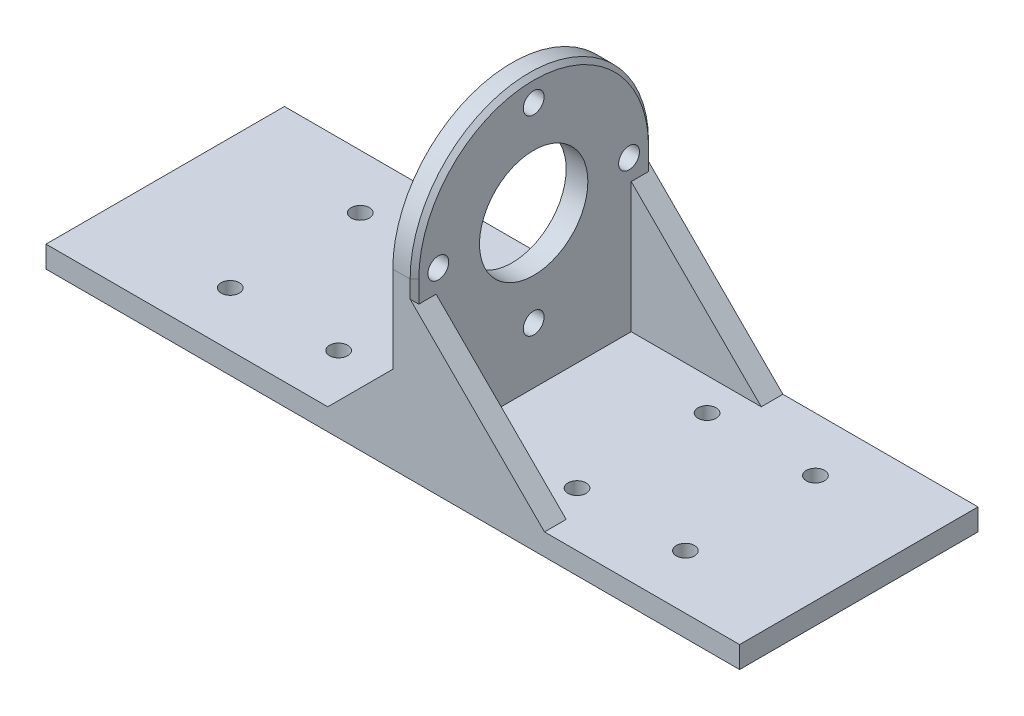
ISO-10303-21;
HEADER;
FILE_DESCRIPTION(('STEP AP214'),'2;1');
FILE_NAME('part.step','',(''),(''),'','','');
FILE_SCHEMA(('AUTOMOTIVE_DESIGN { 1 0 10303 214 1 1 1 1 }'));
ENDSEC;
DATA;
#1=APPLICATION_CONTEXT('core data for automotive mechanical design processes');
#2=APPLICATION_PROTOCOL_DEFINITION('international standard','automotive_design',2000,#1);
#3=PRODUCT_CONTEXT('',#1,'mechanical');
#4=PRODUCT('Part','Part','',(#3));
#5=PRODUCT_RELATED_PRODUCT_CATEGORY('part','',(#4));
#6=PRODUCT_DEFINITION_FORMATION('','',#4);
#7=PRODUCT_DEFINITION_CONTEXT('part definition',#1,'design');
#8=PRODUCT_DEFINITION('design','',#6,#7);
#9=PRODUCT_DEFINITION_SHAPE('','',#8);
#10=(LENGTH_UNIT() NAMED_UNIT(*) SI_UNIT(.MILLI.,.METRE.));
#11=(NAMED_UNIT(*) PLANE_ANGLE_UNIT() SI_UNIT($,.RADIAN.));
#12=(NAMED_UNIT(*) SI_UNIT($,.STERADIAN.) SOLID_ANGLE_UNIT());
#13=UNCERTAINTY_MEASURE_WITH_UNIT(LENGTH_MEASURE(1.E-05),#10,'distance_accuracy_value','');
#14=(GEOMETRIC_REPRESENTATION_CONTEXT(3) GLOBAL_UNCERTAINTY_ASSIGNED_CONTEXT((#13)) GLOBAL_UNIT_ASSIGNED_CONTEXT((#10,
#11,#12)) REPRESENTATION_CONTEXT('',''));
#15=CARTESIAN_POINT('',(0.,0.,0.));
#16=DIRECTION('',(0.,0.,1.));
#17=DIRECTION('',(1.,0.,0.));
#18=AXIS2_PLACEMENT_3D('',#15,#16,#17);
#19=CARTESIAN_POINT('',(5.,0.,0.));
#20=DIRECTION('',(1.,0.,0.));
#21=DIRECTION('',(0.,0.,-1.));
#22=AXIS2_PLACEMENT_3D('',#19,#20,#21);
#23=PLANE('',#22);
#24=DIRECTION('',(0.,0.,-1.));
#25=VECTOR('',#24,1.);
#26=CARTESIAN_POINT('',(5.,-5.00000000000001,0.));
#27=LINE('',#26,#25);
#28=CARTESIAN_POINT('',(5.,-5.00000000000001,-26.5));
#29=VERTEX_POINT('',#28);
#30=CARTESIAN_POINT('',(5.,-5.00000000000001,-22.5));
#31=VERTEX_POINT('',#30);
#32=EDGE_CURVE('E202',#29,#31,#27,.F.);
#33=ORIENTED_EDGE('',*,*,#32,.F.);
#34=DIRECTION('',(0.,1.,0.));
#35=VECTOR('',#34,1.);
#36=CARTESIAN_POINT('',(5.,0.,-26.5));
#37=LINE('',#36,#35);
#38=CARTESIAN_POINT('',(5.,0.,-26.5));
#39=VERTEX_POINT('',#38);
#40=EDGE_CURVE('E409',#29,#39,#37,.T.);
#41=ORIENTED_EDGE('',*,*,#40,.T.);
#42=CARTESIAN_POINT('',(5.,0.,0.));
#43=DIRECTION('',(1.,0.,0.));
#44=DIRECTION('',(0.,0.,-1.));
#45=AXIS2_PLACEMENT_3D('',#42,#43,#44);
#46=CIRCLE('',#45,26.5);
#47=CARTESIAN_POINT('',(5.,0.,26.5));
#48=VERTEX_POINT('',#47);
#49=EDGE_CURVE('E188',#39,#48,#46,.T.);
#50=ORIENTED_EDGE('',*,*,#49,.T.);
#51=DIRECTION('',(0.,-1.,0.));
#52=VECTOR('',#51,1.);
#53=CARTESIAN_POINT('',(5.,-5.00000000000002,26.5));
#54=LINE('',#53,#52);
#55=CARTESIAN_POINT('',(5.,-5.00000000000001,26.5));
#56=VERTEX_POINT('',#55);
#57=EDGE_CURVE('E406',#48,#56,#54,.T.);
#58=ORIENTED_EDGE('',*,*,#57,.T.);
#59=DIRECTION('',(0.,0.,1.));
#60=VECTOR('',#59,1.);
#61=CARTESIAN_POINT('',(5.,-5.00000000000001,0.));
#62=LINE('',#61,#60);
#63=CARTESIAN_POINT('',(5.,-5.00000000000001,22.5));
#64=VERTEX_POINT('',#63);
#65=EDGE_CURVE('E228',#64,#56,#62,.T.);
#66=ORIENTED_EDGE('',*,*,#65,.F.);
#67=DIRECTION('',(0.,-1.,0.));
#68=VECTOR('',#67,1.);
#69=CARTESIAN_POINT('',(5.,0.,22.5));
#70=LINE('',#69,#68);
#71=CARTESIAN_POINT('',(5.,-35.,22.5));
#72=VERTEX_POINT('',#71);
#73=EDGE_CURVE('E221',#64,#72,#70,.T.);
#74=ORIENTED_EDGE('',*,*,#73,.T.);
#75=DIRECTION('',(0.,0.,1.));
#76=VECTOR('',#75,1.);
#77=CARTESIAN_POINT('',(5.,-35.,27.5));
#78=LINE('',#77,#76);
#79=CARTESIAN_POINT('',(5.,-35.,-22.5));
#80=VERTEX_POINT('',#79);
#81=EDGE_CURVE('E232',#80,#72,#78,.T.);
#82=ORIENTED_EDGE('',*,*,#81,.F.);
#83=DIRECTION('',(0.,1.,0.));
#84=VECTOR('',#83,1.);
#85=CARTESIAN_POINT('',(5.,0.,-22.5));
#86=LINE('',#85,#84);
#87=EDGE_CURVE('E196',#80,#31,#86,.T.);
#88=ORIENTED_EDGE('',*,*,#87,.T.);
#89=EDGE_LOOP('',(#33,#41,#50,#58,#66,#74,#82,#88));
#90=FACE_BOUND('',#89,.T.);
#91=CARTESIAN_POINT('',(5.,-22.,0.));
#92=DIRECTION('',(1.,0.,0.));
#93=DIRECTION('',(0.,0.,-1.));
#94=AXIS2_PLACEMENT_3D('',#91,#92,#93);
#95=CIRCLE('',#94,2.4);
#96=CARTESIAN_POINT('',(5.,-22.,-2.4));
#97=VERTEX_POINT('',#96);
#98=EDGE_CURVE('E315',#97,#97,#95,.T.);
#99=ORIENTED_EDGE('',*,*,#98,.F.);
#100=EDGE_LOOP('',(#99));
#101=FACE_BOUND('',#100,.T.);
#102=CARTESIAN_POINT('',(5.,22.,0.));
#103=DIRECTION('',(1.,0.,0.));
#104=DIRECTION('',(0.,0.,-1.));
#105=AXIS2_PLACEMENT_3D('',#102,#103,#104);
#106=CIRCLE('',#105,2.4);
#107=CARTESIAN_POINT('',(5.,22.,-2.4));
#108=VERTEX_POINT('',#107);
#109=EDGE_CURVE('E331',#108,#108,#106,.T.);
#110=ORIENTED_EDGE('',*,*,#109,.F.);
#111=EDGE_LOOP('',(#110));
#112=FACE_BOUND('',#111,.T.);
#113=CARTESIAN_POINT('',(5.,0.,0.));
#114=DIRECTION('',(1.,0.,0.));
#115=DIRECTION('',(0.,0.,-1.));
#116=AXIS2_PLACEMENT_3D('',#113,#114,#115);
#117=CIRCLE('',#116,12.5);
#118=CARTESIAN_POINT('',(5.,0.,-12.5));
#119=VERTEX_POINT('',#118);
#120=EDGE_CURVE('E339',#119,#119,#117,.T.);
#121=ORIENTED_EDGE('',*,*,#120,.F.);
#122=EDGE_LOOP('',(#121));
#123=FACE_BOUND('',#122,.T.);
#124=CARTESIAN_POINT('',(5.,0.,-22.));
#125=DIRECTION('',(1.,0.,0.));
#126=DIRECTION('',(0.,0.,-1.));
#127=AXIS2_PLACEMENT_3D('',#124,#125,#126);
#128=CIRCLE('',#127,2.4);
#129=CARTESIAN_POINT('',(5.,0.,-24.4));
#130=VERTEX_POINT('',#129);
#131=EDGE_CURVE('E323',#130,#130,#128,.T.);
#132=ORIENTED_EDGE('',*,*,#131,.F.);
#133=EDGE_LOOP('',(#132));
#134=FACE_BOUND('',#133,.T.);
#135=CARTESIAN_POINT('',(5.,0.,22.));
#136=DIRECTION('',(1.,0.,0.));
#137=DIRECTION('',(0.,0.,-1.));
#138=AXIS2_PLACEMENT_3D('',#135,#136,#137);
#139=CIRCLE('',#138,2.4);
#140=CARTESIAN_POINT('',(5.,0.,19.6));
#141=VERTEX_POINT('',#140);
#142=EDGE_CURVE('E307',#141,#141,#139,.T.);
#143=ORIENTED_EDGE('',*,*,#142,.F.);
#144=EDGE_LOOP('',(#143));
#145=FACE_BOUND('',#144,.T.);
#146=ADVANCED_FACE('F43',(#90,#101,#112,#123,#134,#145),#23,.T.);
#147=CARTESIAN_POINT('',(0.,0.,0.));
#148=DIRECTION('',(1.,0.,0.));
#149=DIRECTION('',(0.,0.,-1.));
#150=AXIS2_PLACEMENT_3D('',#147,#148,#149);
#151=PLANE('',#150);
#152=CARTESIAN_POINT('',(0.,0.,-22.));
#153=DIRECTION('',(1.,0.,0.));
#154=DIRECTION('',(0.,0.,-1.));
#155=AXIS2_PLACEMENT_3D('',#152,#153,#154);
#156=CIRCLE('',#155,2.4);
#157=CARTESIAN_POINT('',(0.,0.,-24.4));
#158=VERTEX_POINT('',#157);
#159=EDGE_CURVE('E319',#158,#158,#156,.T.);
#160=ORIENTED_EDGE('',*,*,#159,.T.);
#161=EDGE_LOOP('',(#160));
#162=FACE_BOUND('',#161,.T.);
#163=CARTESIAN_POINT('',(0.,0.,0.));
#164=DIRECTION('',(1.,0.,0.));
#165=DIRECTION('',(0.,0.,-1.));
#166=AXIS2_PLACEMENT_3D('',#163,#164,#165);
#167=CIRCLE('',#166,27.5);
#168=CARTESIAN_POINT('',(0.,0.,-27.5));
#169=VERTEX_POINT('',#168);
#170=CARTESIAN_POINT('',(0.,0.,27.5));
#171=VERTEX_POINT('',#170);
#172=EDGE_CURVE('E343',#169,#171,#167,.T.);
#173=ORIENTED_EDGE('',*,*,#172,.F.);
#174=DIRECTION('',(0.,1.,0.));
#175=VECTOR('',#174,1.);
#176=CARTESIAN_POINT('',(0.,-40.,-27.5));
#177=LINE('',#176,#175);
#178=CARTESIAN_POINT('',(0.,-20.,-27.5));
#179=VERTEX_POINT('',#178);
#180=EDGE_CURVE('E354',#179,#169,#177,.T.);
#181=ORIENTED_EDGE('',*,*,#180,.F.);
#182=DIRECTION('',(0.,0.,1.));
#183=VECTOR('',#182,1.);
#184=CARTESIAN_POINT('',(0.,-20.,0.));
#185=LINE('',#184,#183);
#186=CARTESIAN_POINT('',(0.,-20.,-22.5));
#187=VERTEX_POINT('',#186);
#188=EDGE_CURVE('E265',#179,#187,#185,.T.);
#189=ORIENTED_EDGE('',*,*,#188,.T.);
#190=DIRECTION('',(0.,1.,0.));
#191=VECTOR('',#190,1.);
#192=CARTESIAN_POINT('',(0.,0.,-22.5));
#193=LINE('',#192,#191);
#194=CARTESIAN_POINT('',(0.,-30.,-22.5));
#195=VERTEX_POINT('',#194);
#196=EDGE_CURVE('E259',#195,#187,#193,.T.);
#197=ORIENTED_EDGE('',*,*,#196,.F.);
#198=DIRECTION('',(0.,0.,1.));
#199=VECTOR('',#198,1.);
#200=CARTESIAN_POINT('',(0.,-30.,0.));
#201=LINE('',#200,#199);
#202=CARTESIAN_POINT('',(0.,-30.,22.5));
#203=VERTEX_POINT('',#202);
#204=EDGE_CURVE('E385',#195,#203,#201,.T.);
#205=ORIENTED_EDGE('',*,*,#204,.T.);
#206=DIRECTION('',(0.,-1.,0.));
#207=VECTOR('',#206,1.);
#208=CARTESIAN_POINT('',(0.,0.,22.5));
#209=LINE('',#208,#207);
#210=CARTESIAN_POINT('',(0.,-20.,22.5));
#211=VERTEX_POINT('',#210);
#212=EDGE_CURVE('E273',#211,#203,#209,.T.);
#213=ORIENTED_EDGE('',*,*,#212,.F.);
#214=DIRECTION('',(0.,0.,-1.));
#215=VECTOR('',#214,1.);
#216=CARTESIAN_POINT('',(0.,-20.,0.));
#217=LINE('',#216,#215);
#218=CARTESIAN_POINT('',(0.,-20.,27.5));
#219=VERTEX_POINT('',#218);
#220=EDGE_CURVE('E280',#211,#219,#217,.F.);
#221=ORIENTED_EDGE('',*,*,#220,.T.);
#222=DIRECTION('',(0.,-1.,0.));
#223=VECTOR('',#222,1.);
#224=CARTESIAN_POINT('',(0.,0.,27.5));
#225=LINE('',#224,#223);
#226=EDGE_CURVE('E350',#171,#219,#225,.T.);
#227=ORIENTED_EDGE('',*,*,#226,.F.);
#228=EDGE_LOOP('',(#173,#181,#189,#197,#205,#213,#221,#227));
#229=FACE_BOUND('',#228,.T.);
#230=CARTESIAN_POINT('',(0.,0.,0.));
#231=DIRECTION('',(1.,0.,0.));
#232=DIRECTION('',(0.,0.,-1.));
#233=AXIS2_PLACEMENT_3D('',#230,#231,#232);
#234=CIRCLE('',#233,12.5);
#235=CARTESIAN_POINT('',(0.,0.,-12.5));
#236=VERTEX_POINT('',#235);
#237=EDGE_CURVE('E335',#236,#236,#234,.T.);
#238=ORIENTED_EDGE('',*,*,#237,.T.);
#239=EDGE_LOOP('',(#238));
#240=FACE_BOUND('',#239,.T.);
#241=CARTESIAN_POINT('',(0.,22.,0.));
#242=DIRECTION('',(1.,0.,0.));
#243=DIRECTION('',(0.,0.,-1.));
#244=AXIS2_PLACEMENT_3D('',#241,#242,#243);
#245=CIRCLE('',#244,2.4);
#246=CARTESIAN_POINT('',(0.,22.,-2.4));
#247=VERTEX_POINT('',#246);
#248=EDGE_CURVE('E327',#247,#247,#245,.T.);
#249=ORIENTED_EDGE('',*,*,#248,.T.);
#250=EDGE_LOOP('',(#249));
#251=FACE_BOUND('',#250,.T.);
#252=CARTESIAN_POINT('',(0.,-22.,0.));
#253=DIRECTION('',(1.,0.,0.));
#254=DIRECTION('',(0.,0.,-1.));
#255=AXIS2_PLACEMENT_3D('',#252,#253,#254);
#256=CIRCLE('',#255,2.4);
#257=CARTESIAN_POINT('',(0.,-22.,-2.4));
#258=VERTEX_POINT('',#257);
#259=EDGE_CURVE('E311',#258,#258,#256,.T.);
#260=ORIENTED_EDGE('',*,*,#259,.T.);
#261=EDGE_LOOP('',(#260));
#262=FACE_BOUND('',#261,.T.);
#263=CARTESIAN_POINT('',(0.,0.,22.));
#264=DIRECTION('',(1.,0.,0.));
#265=DIRECTION('',(0.,0.,-1.));
#266=AXIS2_PLACEMENT_3D('',#263,#264,#265);
#267=CIRCLE('',#266,2.4);
#268=CARTESIAN_POINT('',(0.,0.,19.6));
#269=VERTEX_POINT('',#268);
#270=EDGE_CURVE('E303',#269,#269,#267,.T.);
#271=ORIENTED_EDGE('',*,*,#270,.T.);
#272=EDGE_LOOP('',(#271));
#273=FACE_BOUND('',#272,.T.);
#274=ADVANCED_FACE('F509',(#162,#229,#240,#251,#262,#273),#151,.F.);
#275=CARTESIAN_POINT('',(5.,0.,0.));
#276=DIRECTION('',(-1.,0.,0.));
#277=DIRECTION('',(0.,0.,1.));
#278=AXIS2_PLACEMENT_3D('',#275,#276,#277);
#279=CYLINDRICAL_SURFACE('',#278,27.5);
#280=DIRECTION('',(-1.,0.,0.));
#281=VECTOR('',#280,1.);
#282=CARTESIAN_POINT('',(5.,0.,27.5));
#283=LINE('',#282,#281);
#284=CARTESIAN_POINT('',(3.99999999999999,0.,27.5));
#285=VERTEX_POINT('',#284);
#286=EDGE_CURVE('E368',#285,#171,#283,.T.);
#287=ORIENTED_EDGE('',*,*,#286,.F.);
#288=CARTESIAN_POINT('',(3.99999999999999,0.,0.));
#289=DIRECTION('',(1.,0.,0.));
#290=DIRECTION('',(0.,0.,-1.));
#291=AXIS2_PLACEMENT_3D('',#288,#289,#290);
#292=CIRCLE('',#291,27.5);
#293=CARTESIAN_POINT('',(3.99999999999999,0.,-27.5));
#294=VERTEX_POINT('',#293);
#295=EDGE_CURVE('E419',#285,#294,#292,.F.);
#296=ORIENTED_EDGE('',*,*,#295,.T.);
#297=DIRECTION('',(-1.,0.,0.));
#298=VECTOR('',#297,1.);
#299=CARTESIAN_POINT('',(5.,0.,-27.5));
#300=LINE('',#299,#298);
#301=EDGE_CURVE('E358',#294,#169,#300,.T.);
#302=ORIENTED_EDGE('',*,*,#301,.T.);
#303=ORIENTED_EDGE('',*,*,#172,.T.);
#304=EDGE_LOOP('',(#287,#296,#302,#303));
#305=FACE_BOUND('',#304,.T.);
#306=ADVANCED_FACE('F515',(#305),#279,.T.);
#307=CARTESIAN_POINT('',(5.,0.,27.5));
#308=DIRECTION('',(0.,0.,-1.));
#309=DIRECTION('',(0.,1.,0.));
#310=AXIS2_PLACEMENT_3D('',#307,#308,#309);
#311=PLANE('',#310);
#312=DIRECTION('',(-0.707106781186548,0.707106781186547,0.));
#313=VECTOR('',#312,1.);
#314=CARTESIAN_POINT('',(35.,-35.,27.5));
#315=LINE('',#314,#313);
#316=CARTESIAN_POINT('',(35.,-35.,27.5));
#317=VERTEX_POINT('',#316);
#318=CARTESIAN_POINT('',(3.99999999999999,-4.,27.5));
#319=VERTEX_POINT('',#318);
#320=EDGE_CURVE('E62',#317,#319,#315,.T.);
#321=ORIENTED_EDGE('',*,*,#320,.T.);
#322=DIRECTION('',(0.,1.,0.));
#323=VECTOR('',#322,1.);
#324=CARTESIAN_POINT('',(3.99999999999999,0.,27.5));
#325=LINE('',#324,#323);
#326=EDGE_CURVE('E66',#319,#285,#325,.T.);
#327=ORIENTED_EDGE('',*,*,#326,.T.);
#328=ORIENTED_EDGE('',*,*,#286,.T.);
#329=ORIENTED_EDGE('',*,*,#226,.T.);
#330=DIRECTION('',(0.707106781186548,0.707106781186547,0.));
#331=VECTOR('',#330,1.);
#332=CARTESIAN_POINT('',(-15.,-35.,27.5));
#333=LINE('',#332,#331);
#334=CARTESIAN_POINT('',(-15.,-35.,27.5));
#335=VERTEX_POINT('',#334);
#336=EDGE_CURVE('E270',#335,#219,#333,.T.);
#337=ORIENTED_EDGE('',*,*,#336,.F.);
#338=DIRECTION('',(1.,0.,0.));
#339=VECTOR('',#338,1.);
#340=CARTESIAN_POINT('',(-80.,-35.,27.5));
#341=LINE('',#340,#339);
#342=CARTESIAN_POINT('',(-80.,-35.,27.5));
#343=VERTEX_POINT('',#342);
#344=EDGE_CURVE('E299',#343,#335,#341,.T.);
#345=ORIENTED_EDGE('',*,*,#344,.F.);
#346=DIRECTION('',(0.,1.,0.));
#347=VECTOR('',#346,1.);
#348=CARTESIAN_POINT('',(-80.,-40.,27.5));
#349=LINE('',#348,#347);
#350=CARTESIAN_POINT('',(-80.,-40.,27.5));
#351=VERTEX_POINT('',#350);
#352=EDGE_CURVE('E291',#351,#343,#349,.T.);
#353=ORIENTED_EDGE('',*,*,#352,.F.);
#354=DIRECTION('',(-1.,0.,0.));
#355=VECTOR('',#354,1.);
#356=CARTESIAN_POINT('',(5.,-40.,27.5));
#357=LINE('',#356,#355);
#358=CARTESIAN_POINT('',(80.,-40.,27.5));
#359=VERTEX_POINT('',#358);
#360=EDGE_CURVE('E364',#359,#351,#357,.T.);
#361=ORIENTED_EDGE('',*,*,#360,.F.);
#362=DIRECTION('',(0.,-1.,0.));
#363=VECTOR('',#362,1.);
#364=CARTESIAN_POINT('',(80.,-40.,27.5));
#365=LINE('',#364,#363);
#366=CARTESIAN_POINT('',(80.,-35.,27.5));
#367=VERTEX_POINT('',#366);
#368=EDGE_CURVE('E233',#367,#359,#365,.T.);
#369=ORIENTED_EDGE('',*,*,#368,.F.);
#370=DIRECTION('',(-1.,0.,0.));
#371=VECTOR('',#370,1.);
#372=CARTESIAN_POINT('',(80.,-35.,27.5));
#373=LINE('',#372,#371);
#374=EDGE_CURVE('E247',#367,#317,#373,.T.);
#375=ORIENTED_EDGE('',*,*,#374,.T.);
#376=EDGE_LOOP('',(#321,#327,#328,#329,#337,#345,#353,#361,#369,#375));
#377=FACE_BOUND('',#376,.T.);
#378=ADVANCED_FACE('F530',(#377),#311,.F.);
#379=CARTESIAN_POINT('',(5.,-40.,27.5));
#380=DIRECTION('',(0.,1.,0.));
#381=DIRECTION('',(0.,0.,1.));
#382=AXIS2_PLACEMENT_3D('',#379,#380,#381);
#383=PLANE('',#382);
#384=CARTESIAN_POINT('',(55.,-40.,15.));
#385=DIRECTION('',(0.,1.,0.));
#386=DIRECTION('',(0.,0.,1.));
#387=AXIS2_PLACEMENT_3D('',#384,#385,#386);
#388=CIRCLE('',#387,2.1);
#389=CARTESIAN_POINT('',(55.,-40.,17.1));
#390=VERTEX_POINT('',#389);
#391=EDGE_CURVE('E455',#390,#390,#388,.F.);
#392=ORIENTED_EDGE('',*,*,#391,.F.);
#393=EDGE_LOOP('',(#392));
#394=FACE_BOUND('',#393,.T.);
#395=CARTESIAN_POINT('',(-25.,-40.,-15.));
#396=DIRECTION('',(0.,1.,0.));
#397=DIRECTION('',(0.,0.,1.));
#398=AXIS2_PLACEMENT_3D('',#395,#396,#397);
#399=CIRCLE('',#398,2.1);
#400=CARTESIAN_POINT('',(-25.,-40.,-12.9));
#401=VERTEX_POINT('',#400);
#402=EDGE_CURVE('E454',#401,#401,#399,.F.);
#403=ORIENTED_EDGE('',*,*,#402,.F.);
#404=EDGE_LOOP('',(#403));
#405=FACE_BOUND('',#404,.T.);
#406=CARTESIAN_POINT('',(-50.,-40.,-15.));
#407=DIRECTION('',(0.,1.,0.));
#408=DIRECTION('',(0.,0.,1.));
#409=AXIS2_PLACEMENT_3D('',#406,#407,#408);
#410=CIRCLE('',#409,2.1);
#411=CARTESIAN_POINT('',(-50.,-40.,-12.9));
#412=VERTEX_POINT('',#411);
#413=EDGE_CURVE('E473',#412,#412,#410,.F.);
#414=ORIENTED_EDGE('',*,*,#413,.F.);
#415=EDGE_LOOP('',(#414));
#416=FACE_BOUND('',#415,.T.);
#417=CARTESIAN_POINT('',(55.,-40.,-15.));
#418=DIRECTION('',(0.,1.,0.));
#419=DIRECTION('',(0.,0.,1.));
#420=AXIS2_PLACEMENT_3D('',#417,#418,#419);
#421=CIRCLE('',#420,2.1);
#422=CARTESIAN_POINT('',(55.,-40.,-12.9));
#423=VERTEX_POINT('',#422);
#424=EDGE_CURVE('E472',#423,#423,#421,.F.);
#425=ORIENTED_EDGE('',*,*,#424,.F.);
#426=EDGE_LOOP('',(#425));
#427=FACE_BOUND('',#426,.T.);
#428=CARTESIAN_POINT('',(30.,-40.,15.));
#429=DIRECTION('',(0.,1.,0.));
#430=DIRECTION('',(0.,0.,1.));
#431=AXIS2_PLACEMENT_3D('',#428,#429,#430);
#432=CIRCLE('',#431,2.1);
#433=CARTESIAN_POINT('',(30.,-40.,17.1));
#434=VERTEX_POINT('',#433);
#435=EDGE_CURVE('E464',#434,#434,#432,.F.);
#436=ORIENTED_EDGE('',*,*,#435,.F.);
#437=EDGE_LOOP('',(#436));
#438=FACE_BOUND('',#437,.T.);
#439=CARTESIAN_POINT('',(-25.,-40.,15.));
#440=DIRECTION('',(0.,1.,0.));
#441=DIRECTION('',(0.,0.,1.));
#442=AXIS2_PLACEMENT_3D('',#439,#440,#441);
#443=CIRCLE('',#442,2.1);
#444=CARTESIAN_POINT('',(-25.,-40.,17.1));
#445=VERTEX_POINT('',#444);
#446=EDGE_CURVE('E447',#445,#445,#443,.F.);
#447=ORIENTED_EDGE('',*,*,#446,.F.);
#448=EDGE_LOOP('',(#447));
#449=FACE_BOUND('',#448,.T.);
#450=CARTESIAN_POINT('',(-50.,-40.,15.));
#451=DIRECTION('',(0.,1.,0.));
#452=DIRECTION('',(0.,0.,1.));
#453=AXIS2_PLACEMENT_3D('',#450,#451,#452);
#454=CIRCLE('',#453,2.1);
#455=CARTESIAN_POINT('',(-50.,-40.,17.1));
#456=VERTEX_POINT('',#455);
#457=EDGE_CURVE('E438',#456,#456,#454,.F.);
#458=ORIENTED_EDGE('',*,*,#457,.F.);
#459=EDGE_LOOP('',(#458));
#460=FACE_BOUND('',#459,.T.);
#461=CARTESIAN_POINT('',(30.,-40.,-15.));
#462=DIRECTION('',(0.,1.,0.));
#463=DIRECTION('',(0.,0.,1.));
#464=AXIS2_PLACEMENT_3D('',#461,#462,#463);
#465=CIRCLE('',#464,2.1);
#466=CARTESIAN_POINT('',(30.,-40.,-12.9));
#467=VERTEX_POINT('',#466);
#468=EDGE_CURVE('E205',#467,#467,#465,.F.);
#469=ORIENTED_EDGE('',*,*,#468,.F.);
#470=EDGE_LOOP('',(#469));
#471=FACE_BOUND('',#470,.T.);
#472=DIRECTION('',(0.,0.,1.));
#473=VECTOR('',#472,1.);
#474=CARTESIAN_POINT('',(-80.,-40.,-27.5));
#475=LINE('',#474,#473);
#476=CARTESIAN_POINT('',(-80.,-40.,-27.5));
#477=VERTEX_POINT('',#476);
#478=EDGE_CURVE('E295',#477,#351,#475,.T.);
#479=ORIENTED_EDGE('',*,*,#478,.F.);
#480=DIRECTION('',(-1.,0.,0.));
#481=VECTOR('',#480,1.);
#482=CARTESIAN_POINT('',(5.,-40.,-27.5));
#483=LINE('',#482,#481);
#484=CARTESIAN_POINT('',(80.,-40.,-27.5));
#485=VERTEX_POINT('',#484);
#486=EDGE_CURVE('E361',#485,#477,#483,.T.);
#487=ORIENTED_EDGE('',*,*,#486,.F.);
#488=DIRECTION('',(0.,0.,-1.));
#489=VECTOR('',#488,1.);
#490=CARTESIAN_POINT('',(80.,-40.,27.5));
#491=LINE('',#490,#489);
#492=EDGE_CURVE('E237',#359,#485,#491,.T.);
#493=ORIENTED_EDGE('',*,*,#492,.F.);
#494=ORIENTED_EDGE('',*,*,#360,.T.);
#495=EDGE_LOOP('',(#479,#487,#493,#494));
#496=FACE_BOUND('',#495,.T.);
#497=ADVANCED_FACE('F526',(#394,#405,#416,#427,#438,#449,#460,#471,#496),#383,.F.);
#498=CARTESIAN_POINT('',(5.,-40.,-27.5));
#499=DIRECTION('',(0.,0.,1.));
#500=DIRECTION('',(0.,-1.,0.));
#501=AXIS2_PLACEMENT_3D('',#498,#499,#500);
#502=PLANE('',#501);
#503=ORIENTED_EDGE('',*,*,#301,.F.);
#504=DIRECTION('',(0.,-1.,0.));
#505=VECTOR('',#504,1.);
#506=CARTESIAN_POINT('',(3.99999999999999,-5.00000000000002,-27.5));
#507=LINE('',#506,#505);
#508=CARTESIAN_POINT('',(4.,-4.00000000000001,-27.5));
#509=VERTEX_POINT('',#508);
#510=EDGE_CURVE('E413',#294,#509,#507,.T.);
#511=ORIENTED_EDGE('',*,*,#510,.T.);
#512=DIRECTION('',(-0.707106781186548,0.707106781186547,0.));
#513=VECTOR('',#512,1.);
#514=CARTESIAN_POINT('',(35.,-35.,-27.5));
#515=LINE('',#514,#513);
#516=CARTESIAN_POINT('',(35.,-35.,-27.5));
#517=VERTEX_POINT('',#516);
#518=EDGE_CURVE('E204',#517,#509,#515,.T.);
#519=ORIENTED_EDGE('',*,*,#518,.F.);
#520=DIRECTION('',(-1.,0.,0.));
#521=VECTOR('',#520,1.);
#522=CARTESIAN_POINT('',(80.,-35.,-27.5));
#523=LINE('',#522,#521);
#524=CARTESIAN_POINT('',(80.,-35.,-27.5));
#525=VERTEX_POINT('',#524);
#526=EDGE_CURVE('E183',#525,#517,#523,.T.);
#527=ORIENTED_EDGE('',*,*,#526,.F.);
#528=DIRECTION('',(0.,1.,0.));
#529=VECTOR('',#528,1.);
#530=CARTESIAN_POINT('',(80.,-40.,-27.5));
#531=LINE('',#530,#529);
#532=EDGE_CURVE('E241',#485,#525,#531,.T.);
#533=ORIENTED_EDGE('',*,*,#532,.F.);
#534=ORIENTED_EDGE('',*,*,#486,.T.);
#535=DIRECTION('',(0.,1.,0.));
#536=VECTOR('',#535,1.);
#537=CARTESIAN_POINT('',(-80.,-40.,-27.5));
#538=LINE('',#537,#536);
#539=CARTESIAN_POINT('',(-80.,-35.,-27.5));
#540=VERTEX_POINT('',#539);
#541=EDGE_CURVE('E284',#477,#540,#538,.T.);
#542=ORIENTED_EDGE('',*,*,#541,.T.);
#543=DIRECTION('',(1.,0.,0.));
#544=VECTOR('',#543,1.);
#545=CARTESIAN_POINT('',(-80.,-35.,-27.5));
#546=LINE('',#545,#544);
#547=CARTESIAN_POINT('',(-15.,-35.,-27.5));
#548=VERTEX_POINT('',#547);
#549=EDGE_CURVE('E298',#540,#548,#546,.T.);
#550=ORIENTED_EDGE('',*,*,#549,.T.);
#551=DIRECTION('',(0.707106781186548,0.707106781186547,0.));
#552=VECTOR('',#551,1.);
#553=CARTESIAN_POINT('',(-15.,-35.,-27.5));
#554=LINE('',#553,#552);
#555=EDGE_CURVE('E255',#548,#179,#554,.T.);
#556=ORIENTED_EDGE('',*,*,#555,.T.);
#557=ORIENTED_EDGE('',*,*,#180,.T.);
#558=EDGE_LOOP('',(#503,#511,#519,#527,#533,#534,#542,#550,#556,#557));
#559=FACE_BOUND('',#558,.T.);
#560=ADVANCED_FACE('F523',(#559),#502,.F.);
#561=CARTESIAN_POINT('',(5.,0.,0.));
#562=DIRECTION('',(-1.,0.,0.));
#563=DIRECTION('',(0.,0.,1.));
#564=AXIS2_PLACEMENT_3D('',#561,#562,#563);
#565=CYLINDRICAL_SURFACE('',#564,12.5);
#566=ORIENTED_EDGE('',*,*,#120,.T.);
#567=EDGE_LOOP('',(#566));
#568=FACE_BOUND('',#567,.T.);
#569=ORIENTED_EDGE('',*,*,#237,.F.);
#570=EDGE_LOOP('',(#569));
#571=FACE_BOUND('',#570,.T.);
#572=ADVANCED_FACE('F520',(#568,#571),#565,.F.);
#573=CARTESIAN_POINT('',(5.,22.,0.));
#574=DIRECTION('',(-1.,0.,0.));
#575=DIRECTION('',(0.,0.,1.));
#576=AXIS2_PLACEMENT_3D('',#573,#574,#575);
#577=CYLINDRICAL_SURFACE('',#576,2.4);
#578=ORIENTED_EDGE('',*,*,#109,.T.);
#579=EDGE_LOOP('',(#578));
#580=FACE_BOUND('',#579,.T.);
#581=ORIENTED_EDGE('',*,*,#248,.F.);
#582=EDGE_LOOP('',(#581));
#583=FACE_BOUND('',#582,.T.);
#584=ADVANCED_FACE('F629',(#580,#583),#577,.F.);
#585=CARTESIAN_POINT('',(5.,0.,-22.));
#586=DIRECTION('',(-1.,0.,0.));
#587=DIRECTION('',(0.,0.,1.));
#588=AXIS2_PLACEMENT_3D('',#585,#586,#587);
#589=CYLINDRICAL_SURFACE('',#588,2.4);
#590=ORIENTED_EDGE('',*,*,#159,.F.);
#591=EDGE_LOOP('',(#590));
#592=FACE_BOUND('',#591,.T.);
#593=ORIENTED_EDGE('',*,*,#131,.T.);
#594=EDGE_LOOP('',(#593));
#595=FACE_BOUND('',#594,.T.);
#596=ADVANCED_FACE('F626',(#592,#595),#589,.F.);
#597=CARTESIAN_POINT('',(5.,-22.,0.));
#598=DIRECTION('',(-1.,0.,0.));
#599=DIRECTION('',(0.,0.,1.));
#600=AXIS2_PLACEMENT_3D('',#597,#598,#599);
#601=CYLINDRICAL_SURFACE('',#600,2.4);
#602=ORIENTED_EDGE('',*,*,#98,.T.);
#603=EDGE_LOOP('',(#602));
#604=FACE_BOUND('',#603,.T.);
#605=ORIENTED_EDGE('',*,*,#259,.F.);
#606=EDGE_LOOP('',(#605));
#607=FACE_BOUND('',#606,.T.);
#608=ADVANCED_FACE('F622',(#604,#607),#601,.F.);
#609=CARTESIAN_POINT('',(5.,0.,22.));
#610=DIRECTION('',(-1.,0.,0.));
#611=DIRECTION('',(0.,0.,1.));
#612=AXIS2_PLACEMENT_3D('',#609,#610,#611);
#613=CYLINDRICAL_SURFACE('',#612,2.4);
#614=ORIENTED_EDGE('',*,*,#270,.F.);
#615=EDGE_LOOP('',(#614));
#616=FACE_BOUND('',#615,.T.);
#617=ORIENTED_EDGE('',*,*,#142,.T.);
#618=EDGE_LOOP('',(#617));
#619=FACE_BOUND('',#618,.T.);
#620=ADVANCED_FACE('F615',(#616,#619),#613,.F.);
#621=CARTESIAN_POINT('',(-80.,-35.,-27.5));
#622=DIRECTION('',(0.,1.,0.));
#623=DIRECTION('',(0.,0.,1.));
#624=AXIS2_PLACEMENT_3D('',#621,#622,#623);
#625=PLANE('',#624);
#626=CARTESIAN_POINT('',(-25.,-35.,-15.));
#627=DIRECTION('',(0.,1.,0.));
#628=DIRECTION('',(0.,0.,1.));
#629=AXIS2_PLACEMENT_3D('',#626,#627,#628);
#630=CIRCLE('',#629,2.1);
#631=CARTESIAN_POINT('',(-25.,-35.,-12.9));
#632=VERTEX_POINT('',#631);
#633=EDGE_CURVE('E450',#632,#632,#630,.T.);
#634=ORIENTED_EDGE('',*,*,#633,.F.);
#635=EDGE_LOOP('',(#634));
#636=FACE_BOUND('',#635,.T.);
#637=CARTESIAN_POINT('',(-50.,-35.,-15.));
#638=DIRECTION('',(0.,1.,0.));
#639=DIRECTION('',(0.,0.,1.));
#640=AXIS2_PLACEMENT_3D('',#637,#638,#639);
#641=CIRCLE('',#640,2.1);
#642=CARTESIAN_POINT('',(-50.,-35.,-12.9));
#643=VERTEX_POINT('',#642);
#644=EDGE_CURVE('E459',#643,#643,#641,.T.);
#645=ORIENTED_EDGE('',*,*,#644,.F.);
#646=EDGE_LOOP('',(#645));
#647=FACE_BOUND('',#646,.T.);
#648=CARTESIAN_POINT('',(-25.,-35.,15.));
#649=DIRECTION('',(0.,1.,0.));
#650=DIRECTION('',(0.,0.,-1.));
#651=AXIS2_PLACEMENT_3D('',#648,#649,#650);
#652=CIRCLE('',#651,2.1);
#653=CARTESIAN_POINT('',(-25.,-35.,12.9));
#654=VERTEX_POINT('',#653);
#655=EDGE_CURVE('E444',#654,#654,#652,.T.);
#656=ORIENTED_EDGE('',*,*,#655,.F.);
#657=EDGE_LOOP('',(#656));
#658=FACE_BOUND('',#657,.T.);
#659=CARTESIAN_POINT('',(-50.,-35.,15.));
#660=DIRECTION('',(0.,1.,0.));
#661=DIRECTION('',(0.,0.,-1.));
#662=AXIS2_PLACEMENT_3D('',#659,#660,#661);
#663=CIRCLE('',#662,2.1);
#664=CARTESIAN_POINT('',(-50.,-35.,12.9));
#665=VERTEX_POINT('',#664);
#666=EDGE_CURVE('E432',#665,#665,#663,.T.);
#667=ORIENTED_EDGE('',*,*,#666,.F.);
#668=EDGE_LOOP('',(#667));
#669=FACE_BOUND('',#668,.T.);
#670=DIRECTION('',(0.,0.,1.));
#671=VECTOR('',#670,1.);
#672=CARTESIAN_POINT('',(-80.,-35.,-27.5));
#673=LINE('',#672,#671);
#674=EDGE_CURVE('E288',#540,#343,#673,.T.);
#675=ORIENTED_EDGE('',*,*,#674,.T.);
#676=ORIENTED_EDGE('',*,*,#344,.T.);
#677=DIRECTION('',(0.,0.,-1.));
#678=VECTOR('',#677,1.);
#679=CARTESIAN_POINT('',(-15.,-35.,-27.5));
#680=LINE('',#679,#678);
#681=CARTESIAN_POINT('',(-15.,-35.,22.5));
#682=VERTEX_POINT('',#681);
#683=EDGE_CURVE('E375',#682,#335,#680,.F.);
#684=ORIENTED_EDGE('',*,*,#683,.F.);
#685=DIRECTION('',(1.,0.,0.));
#686=VECTOR('',#685,1.);
#687=CARTESIAN_POINT('',(-80.,-35.,22.5));
#688=LINE('',#687,#686);
#689=CARTESIAN_POINT('',(-4.99999999999998,-35.,22.5));
#690=VERTEX_POINT('',#689);
#691=EDGE_CURVE('E371',#682,#690,#688,.T.);
#692=ORIENTED_EDGE('',*,*,#691,.T.);
#693=DIRECTION('',(0.,0.,-1.));
#694=VECTOR('',#693,1.);
#695=CARTESIAN_POINT('',(-4.99999999999998,-35.,-27.5));
#696=LINE('',#695,#694);
#697=CARTESIAN_POINT('',(-4.99999999999998,-35.,-22.5));
#698=VERTEX_POINT('',#697);
#699=EDGE_CURVE('E392',#690,#698,#696,.T.);
#700=ORIENTED_EDGE('',*,*,#699,.T.);
#701=DIRECTION('',(-1.,0.,0.));
#702=VECTOR('',#701,1.);
#703=CARTESIAN_POINT('',(-80.,-35.,-22.5));
#704=LINE('',#703,#702);
#705=CARTESIAN_POINT('',(-15.,-35.,-22.5));
#706=VERTEX_POINT('',#705);
#707=EDGE_CURVE('E378',#698,#706,#704,.T.);
#708=ORIENTED_EDGE('',*,*,#707,.T.);
#709=DIRECTION('',(0.,0.,1.));
#710=VECTOR('',#709,1.);
#711=CARTESIAN_POINT('',(-15.,-35.,-27.5));
#712=LINE('',#711,#710);
#713=EDGE_CURVE('E381',#548,#706,#712,.T.);
#714=ORIENTED_EDGE('',*,*,#713,.F.);
#715=ORIENTED_EDGE('',*,*,#549,.F.);
#716=EDGE_LOOP('',(#675,#676,#684,#692,#700,#708,#714,#715));
#717=FACE_BOUND('',#716,.T.);
#718=ADVANCED_FACE('F587',(#636,#647,#658,#669,#717),#625,.T.);
#719=CARTESIAN_POINT('',(-80.,0.,0.));
#720=DIRECTION('',(1.,0.,0.));
#721=DIRECTION('',(0.,0.,-1.));
#722=AXIS2_PLACEMENT_3D('',#719,#720,#721);
#723=PLANE('',#722);
#724=ORIENTED_EDGE('',*,*,#478,.T.);
#725=ORIENTED_EDGE('',*,*,#352,.T.);
#726=ORIENTED_EDGE('',*,*,#674,.F.);
#727=ORIENTED_EDGE('',*,*,#541,.F.);
#728=EDGE_LOOP('',(#724,#725,#726,#727));
#729=FACE_BOUND('',#728,.T.);
#730=ADVANCED_FACE('F600',(#729),#723,.F.);
#731=CARTESIAN_POINT('',(-15.,-35.,25.));
#732=DIRECTION('',(0.707106781186547,-0.707106781186548,0.));
#733=DIRECTION('',(0.707106781186548,0.707106781186547,0.));
#734=AXIS2_PLACEMENT_3D('',#731,#732,#733);
#735=PLANE('',#734);
#736=ORIENTED_EDGE('',*,*,#220,.F.);
#737=DIRECTION('',(0.707106781186548,0.707106781186547,0.));
#738=VECTOR('',#737,1.);
#739=CARTESIAN_POINT('',(-15.,-35.,22.5));
#740=LINE('',#739,#738);
#741=EDGE_CURVE('E269',#682,#211,#740,.T.);
#742=ORIENTED_EDGE('',*,*,#741,.F.);
#743=ORIENTED_EDGE('',*,*,#683,.T.);
#744=ORIENTED_EDGE('',*,*,#336,.T.);
#745=EDGE_LOOP('',(#736,#742,#743,#744));
#746=FACE_BOUND('',#745,.T.);
#747=ADVANCED_FACE('F581',(#746),#735,.F.);
#748=CARTESIAN_POINT('',(-37.5,-6.25,22.5));
#749=DIRECTION('',(0.,0.,1.));
#750=DIRECTION('',(1.,0.,0.));
#751=AXIS2_PLACEMENT_3D('',#748,#749,#750);
#752=PLANE('',#751);
#753=ORIENTED_EDGE('',*,*,#212,.T.);
#754=DIRECTION('',(-0.707106781186544,-0.707106781186551,0.));
#755=VECTOR('',#754,1.);
#756=CARTESIAN_POINT('',(0.,-30.,22.5));
#757=LINE('',#756,#755);
#758=EDGE_CURVE('E389',#203,#690,#757,.T.);
#759=ORIENTED_EDGE('',*,*,#758,.T.);
#760=ORIENTED_EDGE('',*,*,#691,.F.);
#761=ORIENTED_EDGE('',*,*,#741,.T.);
#762=EDGE_LOOP('',(#753,#759,#760,#761));
#763=FACE_BOUND('',#762,.T.);
#764=ADVANCED_FACE('F584',(#763),#752,.F.);
#765=CARTESIAN_POINT('',(-15.,-35.,-25.));
#766=DIRECTION('',(-0.707106781186547,0.707106781186548,0.));
#767=DIRECTION('',(0.707106781186548,0.707106781186547,0.));
#768=AXIS2_PLACEMENT_3D('',#765,#766,#767);
#769=PLANE('',#768);
#770=ORIENTED_EDGE('',*,*,#188,.F.);
#771=ORIENTED_EDGE('',*,*,#555,.F.);
#772=ORIENTED_EDGE('',*,*,#713,.T.);
#773=DIRECTION('',(0.707106781186548,0.707106781186547,0.));
#774=VECTOR('',#773,1.);
#775=CARTESIAN_POINT('',(-15.,-35.,-22.5));
#776=LINE('',#775,#774);
#777=EDGE_CURVE('E254',#706,#187,#776,.T.);
#778=ORIENTED_EDGE('',*,*,#777,.T.);
#779=EDGE_LOOP('',(#770,#771,#772,#778));
#780=FACE_BOUND('',#779,.T.);
#781=ADVANCED_FACE('F595',(#780),#769,.T.);
#782=CARTESIAN_POINT('',(-37.5,-6.25,-22.5));
#783=DIRECTION('',(0.,0.,-1.));
#784=DIRECTION('',(-1.,0.,0.));
#785=AXIS2_PLACEMENT_3D('',#782,#783,#784);
#786=PLANE('',#785);
#787=ORIENTED_EDGE('',*,*,#707,.F.);
#788=DIRECTION('',(0.707106781186544,0.707106781186551,0.));
#789=VECTOR('',#788,1.);
#790=CARTESIAN_POINT('',(0.,-30.,-22.5));
#791=LINE('',#790,#789);
#792=EDGE_CURVE('E395',#698,#195,#791,.T.);
#793=ORIENTED_EDGE('',*,*,#792,.T.);
#794=ORIENTED_EDGE('',*,*,#196,.T.);
#795=ORIENTED_EDGE('',*,*,#777,.F.);
#796=EDGE_LOOP('',(#787,#793,#794,#795));
#797=FACE_BOUND('',#796,.T.);
#798=ADVANCED_FACE('F502',(#797),#786,.F.);
#799=CARTESIAN_POINT('',(0.,-30.,0.));
#800=DIRECTION('',(0.707106781186551,-0.707106781186544,0.));
#801=DIRECTION('',(0.,0.,1.));
#802=AXIS2_PLACEMENT_3D('',#799,#800,#801);
#803=PLANE('',#802);
#804=ORIENTED_EDGE('',*,*,#792,.F.);
#805=ORIENTED_EDGE('',*,*,#699,.F.);
#806=ORIENTED_EDGE('',*,*,#758,.F.);
#807=ORIENTED_EDGE('',*,*,#204,.F.);
#808=EDGE_LOOP('',(#804,#805,#806,#807));
#809=FACE_BOUND('',#808,.T.);
#810=ADVANCED_FACE('F492',(#809),#803,.F.);
#811=CARTESIAN_POINT('',(80.,-35.,27.5));
#812=DIRECTION('',(0.,-1.,0.));
#813=DIRECTION('',(0.,0.,-1.));
#814=AXIS2_PLACEMENT_3D('',#811,#812,#813);
#815=PLANE('',#814);
#816=CARTESIAN_POINT('',(55.,-35.,15.));
#817=DIRECTION('',(0.,1.,0.));
#818=DIRECTION('',(0.,0.,-1.));
#819=AXIS2_PLACEMENT_3D('',#816,#817,#818);
#820=CIRCLE('',#819,2.1);
#821=CARTESIAN_POINT('',(55.,-35.,12.9));
#822=VERTEX_POINT('',#821);
#823=EDGE_CURVE('E460',#822,#822,#820,.T.);
#824=ORIENTED_EDGE('',*,*,#823,.F.);
#825=EDGE_LOOP('',(#824));
#826=FACE_BOUND('',#825,.T.);
#827=CARTESIAN_POINT('',(55.,-35.,-15.));
#828=DIRECTION('',(0.,1.,0.));
#829=DIRECTION('',(0.,0.,1.));
#830=AXIS2_PLACEMENT_3D('',#827,#828,#829);
#831=CIRCLE('',#830,2.1);
#832=CARTESIAN_POINT('',(55.,-35.,-12.9));
#833=VERTEX_POINT('',#832);
#834=EDGE_CURVE('E468',#833,#833,#831,.T.);
#835=ORIENTED_EDGE('',*,*,#834,.F.);
#836=EDGE_LOOP('',(#835));
#837=FACE_BOUND('',#836,.T.);
#838=CARTESIAN_POINT('',(30.,-35.,15.));
#839=DIRECTION('',(0.,1.,0.));
#840=DIRECTION('',(0.,0.,-1.));
#841=AXIS2_PLACEMENT_3D('',#838,#839,#840);
#842=CIRCLE('',#841,2.1);
#843=CARTESIAN_POINT('',(30.,-35.,12.9));
#844=VERTEX_POINT('',#843);
#845=EDGE_CURVE('E940',#844,#844,#842,.T.);
#846=ORIENTED_EDGE('',*,*,#845,.F.);
#847=EDGE_LOOP('',(#846));
#848=FACE_BOUND('',#847,.T.);
#849=CARTESIAN_POINT('',(30.,-35.,-15.));
#850=DIRECTION('',(0.,1.,0.));
#851=DIRECTION('',(0.,0.,1.));
#852=AXIS2_PLACEMENT_3D('',#849,#850,#851);
#853=CIRCLE('',#852,2.1);
#854=CARTESIAN_POINT('',(30.,-35.,-12.9));
#855=VERTEX_POINT('',#854);
#856=EDGE_CURVE('E211',#855,#855,#853,.T.);
#857=ORIENTED_EDGE('',*,*,#856,.F.);
#858=EDGE_LOOP('',(#857));
#859=FACE_BOUND('',#858,.T.);
#860=ORIENTED_EDGE('',*,*,#526,.T.);
#861=DIRECTION('',(0.,0.,-1.));
#862=VECTOR('',#861,1.);
#863=CARTESIAN_POINT('',(35.,-35.,27.5));
#864=LINE('',#863,#862);
#865=CARTESIAN_POINT('',(35.,-35.,-22.5));
#866=VERTEX_POINT('',#865);
#867=EDGE_CURVE('E176',#517,#866,#864,.F.);
#868=ORIENTED_EDGE('',*,*,#867,.T.);
#869=DIRECTION('',(1.,0.,0.));
#870=VECTOR('',#869,1.);
#871=CARTESIAN_POINT('',(80.,-35.,-22.5));
#872=LINE('',#871,#870);
#873=EDGE_CURVE('E179',#80,#866,#872,.T.);
#874=ORIENTED_EDGE('',*,*,#873,.F.);
#875=ORIENTED_EDGE('',*,*,#81,.T.);
#876=DIRECTION('',(-1.,0.,0.));
#877=VECTOR('',#876,1.);
#878=CARTESIAN_POINT('',(80.,-35.,22.5));
#879=LINE('',#878,#877);
#880=CARTESIAN_POINT('',(35.,-35.,22.5));
#881=VERTEX_POINT('',#880);
#882=EDGE_CURVE('E398',#881,#72,#879,.T.);
#883=ORIENTED_EDGE('',*,*,#882,.F.);
#884=DIRECTION('',(0.,0.,1.));
#885=VECTOR('',#884,1.);
#886=CARTESIAN_POINT('',(35.,-35.,27.5));
#887=LINE('',#886,#885);
#888=EDGE_CURVE('E198',#881,#317,#887,.T.);
#889=ORIENTED_EDGE('',*,*,#888,.T.);
#890=ORIENTED_EDGE('',*,*,#374,.F.);
#891=DIRECTION('',(0.,0.,1.));
#892=VECTOR('',#891,1.);
#893=CARTESIAN_POINT('',(80.,-35.,27.5));
#894=LINE('',#893,#892);
#895=EDGE_CURVE('E244',#525,#367,#894,.T.);
#896=ORIENTED_EDGE('',*,*,#895,.F.);
#897=EDGE_LOOP('',(#860,#868,#874,#875,#883,#889,#890,#896));
#898=FACE_BOUND('',#897,.T.);
#899=ADVANCED_FACE('F178',(#826,#837,#848,#859,#898),#815,.F.);
#900=CARTESIAN_POINT('',(80.,0.,0.));
#901=DIRECTION('',(-1.,0.,0.));
#902=DIRECTION('',(0.,0.,1.));
#903=AXIS2_PLACEMENT_3D('',#900,#901,#902);
#904=PLANE('',#903);
#905=ORIENTED_EDGE('',*,*,#368,.T.);
#906=ORIENTED_EDGE('',*,*,#492,.T.);
#907=ORIENTED_EDGE('',*,*,#532,.T.);
#908=ORIENTED_EDGE('',*,*,#895,.T.);
#909=EDGE_LOOP('',(#905,#906,#907,#908));
#910=FACE_BOUND('',#909,.T.);
#911=ADVANCED_FACE('F491',(#910),#904,.F.);
#912=CARTESIAN_POINT('',(35.,-35.,25.));
#913=DIRECTION('',(0.707106781186547,0.707106781186548,0.));
#914=DIRECTION('',(-0.707106781186548,0.707106781186547,0.));
#915=AXIS2_PLACEMENT_3D('',#912,#913,#914);
#916=PLANE('',#915);
#917=DIRECTION('',(-0.707106781186548,0.707106781186547,0.));
#918=VECTOR('',#917,1.);
#919=CARTESIAN_POINT('',(35.,-35.,22.5));
#920=LINE('',#919,#918);
#921=EDGE_CURVE('E218',#881,#64,#920,.T.);
#922=ORIENTED_EDGE('',*,*,#921,.T.);
#923=ORIENTED_EDGE('',*,*,#65,.T.);
#924=DIRECTION('',(-0.577350269189623,0.577350269189623,0.577350269189631));
#925=VECTOR('',#924,1.);
#926=CARTESIAN_POINT('',(3.33333333333335,-3.33333333333336,28.1666666666667));
#927=LINE('',#926,#925);
#928=EDGE_CURVE('E11',#56,#319,#927,.T.);
#929=ORIENTED_EDGE('',*,*,#928,.T.);
#930=ORIENTED_EDGE('',*,*,#320,.F.);
#931=ORIENTED_EDGE('',*,*,#888,.F.);
#932=EDGE_LOOP('',(#922,#923,#929,#930,#931));
#933=FACE_BOUND('',#932,.T.);
#934=ADVANCED_FACE('F499',(#933),#916,.T.);
#935=CARTESIAN_POINT('',(0.,-6.25,22.5));
#936=DIRECTION('',(0.,0.,1.));
#937=DIRECTION('',(1.,0.,0.));
#938=AXIS2_PLACEMENT_3D('',#935,#936,#937);
#939=PLANE('',#938);
#940=ORIENTED_EDGE('',*,*,#73,.F.);
#941=ORIENTED_EDGE('',*,*,#921,.F.);
#942=ORIENTED_EDGE('',*,*,#882,.T.);
#943=EDGE_LOOP('',(#940,#941,#942));
#944=FACE_BOUND('',#943,.T.);
#945=ADVANCED_FACE('F568',(#944),#939,.F.);
#946=CARTESIAN_POINT('',(35.,-35.,-25.));
#947=DIRECTION('',(-0.707106781186547,-0.707106781186548,0.));
#948=DIRECTION('',(-0.707106781186548,0.707106781186547,0.));
#949=AXIS2_PLACEMENT_3D('',#946,#947,#948);
#950=PLANE('',#949);
#951=ORIENTED_EDGE('',*,*,#518,.T.);
#952=DIRECTION('',(-0.577350269189623,0.577350269189623,-0.577350269189631));
#953=VECTOR('',#952,1.);
#954=CARTESIAN_POINT('',(3.33333333333335,-3.33333333333336,-28.1666666666667));
#955=LINE('',#954,#953);
#956=EDGE_CURVE('E54',#509,#29,#955,.F.);
#957=ORIENTED_EDGE('',*,*,#956,.T.);
#958=ORIENTED_EDGE('',*,*,#32,.T.);
#959=DIRECTION('',(-0.707106781186548,0.707106781186547,0.));
#960=VECTOR('',#959,1.);
#961=CARTESIAN_POINT('',(35.,-35.,-22.5));
#962=LINE('',#961,#960);
#963=EDGE_CURVE('E194',#866,#31,#962,.T.);
#964=ORIENTED_EDGE('',*,*,#963,.F.);
#965=ORIENTED_EDGE('',*,*,#867,.F.);
#966=EDGE_LOOP('',(#951,#957,#958,#964,#965));
#967=FACE_BOUND('',#966,.T.);
#968=ADVANCED_FACE('F200',(#967),#950,.F.);
#969=CARTESIAN_POINT('',(0.,-6.25,-22.5));
#970=DIRECTION('',(0.,0.,-1.));
#971=DIRECTION('',(-1.,0.,0.));
#972=AXIS2_PLACEMENT_3D('',#969,#970,#971);
#973=PLANE('',#972);
#974=ORIENTED_EDGE('',*,*,#87,.F.);
#975=ORIENTED_EDGE('',*,*,#873,.T.);
#976=ORIENTED_EDGE('',*,*,#963,.T.);
#977=EDGE_LOOP('',(#974,#975,#976));
#978=FACE_BOUND('',#977,.T.);
#979=ADVANCED_FACE('F193',(#978),#973,.F.);
#980=CARTESIAN_POINT('',(30.,-40.001,-15.));
#981=DIRECTION('',(0.,1.,0.));
#982=DIRECTION('',(0.,0.,1.));
#983=AXIS2_PLACEMENT_3D('',#980,#981,#982);
#984=CYLINDRICAL_SURFACE('',#983,2.1);
#985=ORIENTED_EDGE('',*,*,#856,.T.);
#986=EDGE_LOOP('',(#985));
#987=FACE_BOUND('',#986,.T.);
#988=ORIENTED_EDGE('',*,*,#468,.T.);
#989=EDGE_LOOP('',(#988));
#990=FACE_BOUND('',#989,.T.);
#991=ADVANCED_FACE('F487',(#987,#990),#984,.F.);
#992=CARTESIAN_POINT('',(30.,-40.001,15.));
#993=DIRECTION('',(0.,1.,0.));
#994=DIRECTION('',(0.,0.,1.));
#995=AXIS2_PLACEMENT_3D('',#992,#993,#994);
#996=CYLINDRICAL_SURFACE('',#995,2.1);
#997=ORIENTED_EDGE('',*,*,#845,.T.);
#998=EDGE_LOOP('',(#997));
#999=FACE_BOUND('',#998,.T.);
#1000=ORIENTED_EDGE('',*,*,#435,.T.);
#1001=EDGE_LOOP('',(#1000));
#1002=FACE_BOUND('',#1001,.T.);
#1003=ADVANCED_FACE('F722',(#999,#1002),#996,.F.);
#1004=CARTESIAN_POINT('',(55.,-40.001,-15.));
#1005=DIRECTION('',(0.,1.,0.));
#1006=DIRECTION('',(0.,0.,1.));
#1007=AXIS2_PLACEMENT_3D('',#1004,#1005,#1006);
#1008=CYLINDRICAL_SURFACE('',#1007,2.1);
#1009=ORIENTED_EDGE('',*,*,#834,.T.);
#1010=EDGE_LOOP('',(#1009));
#1011=FACE_BOUND('',#1010,.T.);
#1012=ORIENTED_EDGE('',*,*,#424,.T.);
#1013=EDGE_LOOP('',(#1012));
#1014=FACE_BOUND('',#1013,.T.);
#1015=ADVANCED_FACE('F728',(#1011,#1014),#1008,.F.);
#1016=CARTESIAN_POINT('',(55.,-40.001,15.));
#1017=DIRECTION('',(0.,1.,0.));
#1018=DIRECTION('',(0.,0.,1.));
#1019=AXIS2_PLACEMENT_3D('',#1016,#1017,#1018);
#1020=CYLINDRICAL_SURFACE('',#1019,2.1);
#1021=ORIENTED_EDGE('',*,*,#823,.T.);
#1022=EDGE_LOOP('',(#1021));
#1023=FACE_BOUND('',#1022,.T.);
#1024=ORIENTED_EDGE('',*,*,#391,.T.);
#1025=EDGE_LOOP('',(#1024));
#1026=FACE_BOUND('',#1025,.T.);
#1027=ADVANCED_FACE('F736',(#1023,#1026),#1020,.F.);
#1028=CARTESIAN_POINT('',(-50.,-40.001,15.));
#1029=DIRECTION('',(0.,1.,0.));
#1030=DIRECTION('',(0.,0.,1.));
#1031=AXIS2_PLACEMENT_3D('',#1028,#1029,#1030);
#1032=CYLINDRICAL_SURFACE('',#1031,2.1);
#1033=ORIENTED_EDGE('',*,*,#666,.T.);
#1034=EDGE_LOOP('',(#1033));
#1035=FACE_BOUND('',#1034,.T.);
#1036=ORIENTED_EDGE('',*,*,#457,.T.);
#1037=EDGE_LOOP('',(#1036));
#1038=FACE_BOUND('',#1037,.T.);
#1039=ADVANCED_FACE('F744',(#1035,#1038),#1032,.F.);
#1040=CARTESIAN_POINT('',(-25.,-40.001,15.));
#1041=DIRECTION('',(0.,1.,0.));
#1042=DIRECTION('',(0.,0.,1.));
#1043=AXIS2_PLACEMENT_3D('',#1040,#1041,#1042);
#1044=CYLINDRICAL_SURFACE('',#1043,2.1);
#1045=ORIENTED_EDGE('',*,*,#655,.T.);
#1046=EDGE_LOOP('',(#1045));
#1047=FACE_BOUND('',#1046,.T.);
#1048=ORIENTED_EDGE('',*,*,#446,.T.);
#1049=EDGE_LOOP('',(#1048));
#1050=FACE_BOUND('',#1049,.T.);
#1051=ADVANCED_FACE('F752',(#1047,#1050),#1044,.F.);
#1052=CARTESIAN_POINT('',(-50.,-40.001,-15.));
#1053=DIRECTION('',(0.,1.,0.));
#1054=DIRECTION('',(0.,0.,1.));
#1055=AXIS2_PLACEMENT_3D('',#1052,#1053,#1054);
#1056=CYLINDRICAL_SURFACE('',#1055,2.1);
#1057=ORIENTED_EDGE('',*,*,#644,.T.);
#1058=EDGE_LOOP('',(#1057));
#1059=FACE_BOUND('',#1058,.T.);
#1060=ORIENTED_EDGE('',*,*,#413,.T.);
#1061=EDGE_LOOP('',(#1060));
#1062=FACE_BOUND('',#1061,.T.);
#1063=ADVANCED_FACE('F558',(#1059,#1062),#1056,.F.);
#1064=CARTESIAN_POINT('',(-25.,-40.001,-15.));
#1065=DIRECTION('',(0.,1.,0.));
#1066=DIRECTION('',(0.,0.,1.));
#1067=AXIS2_PLACEMENT_3D('',#1064,#1065,#1066);
#1068=CYLINDRICAL_SURFACE('',#1067,2.1);
#1069=ORIENTED_EDGE('',*,*,#633,.T.);
#1070=EDGE_LOOP('',(#1069));
#1071=FACE_BOUND('',#1070,.T.);
#1072=ORIENTED_EDGE('',*,*,#402,.T.);
#1073=EDGE_LOOP('',(#1072));
#1074=FACE_BOUND('',#1073,.T.);
#1075=ADVANCED_FACE('F553',(#1071,#1074),#1068,.F.);
#1076=CARTESIAN_POINT('',(5.,0.,26.5));
#1077=DIRECTION('',(0.707106781186552,0.,0.707106781186543));
#1078=DIRECTION('',(0.,1.,0.));
#1079=AXIS2_PLACEMENT_3D('',#1076,#1077,#1078);
#1080=PLANE('',#1079);
#1081=ORIENTED_EDGE('',*,*,#928,.F.);
#1082=ORIENTED_EDGE('',*,*,#57,.F.);
#1083=DIRECTION('',(0.707106781186543,0.,-0.707106781186552));
#1084=VECTOR('',#1083,1.);
#1085=CARTESIAN_POINT('',(3.99999999999999,0.,27.5));
#1086=LINE('',#1085,#1084);
#1087=EDGE_CURVE('E48',#285,#48,#1086,.T.);
#1088=ORIENTED_EDGE('',*,*,#1087,.F.);
#1089=ORIENTED_EDGE('',*,*,#326,.F.);
#1090=EDGE_LOOP('',(#1081,#1082,#1088,#1089));
#1091=FACE_BOUND('',#1090,.T.);
#1092=ADVANCED_FACE('F46',(#1091),#1080,.T.);
#1093=CARTESIAN_POINT('',(5.,0.,0.));
#1094=DIRECTION('',(-1.,0.,0.));
#1095=DIRECTION('',(0.,0.,1.));
#1096=AXIS2_PLACEMENT_3D('',#1093,#1094,#1095);
#1097=CONICAL_SURFACE('',#1096,26.5,0.785398163397455);
#1098=ORIENTED_EDGE('',*,*,#1087,.T.);
#1099=ORIENTED_EDGE('',*,*,#49,.F.);
#1100=DIRECTION('',(0.707106781186543,0.,0.707106781186552));
#1101=VECTOR('',#1100,1.);
#1102=CARTESIAN_POINT('',(3.99999999999999,0.,-27.5));
#1103=LINE('',#1102,#1101);
#1104=EDGE_CURVE('E423',#294,#39,#1103,.T.);
#1105=ORIENTED_EDGE('',*,*,#1104,.F.);
#1106=ORIENTED_EDGE('',*,*,#295,.F.);
#1107=EDGE_LOOP('',(#1098,#1099,#1105,#1106));
#1108=FACE_BOUND('',#1107,.T.);
#1109=ADVANCED_FACE('F546',(#1108),#1097,.T.);
#1110=CARTESIAN_POINT('',(5.,0.,-26.5));
#1111=DIRECTION('',(0.707106781186552,0.,-0.707106781186543));
#1112=DIRECTION('',(0.,-1.,0.));
#1113=AXIS2_PLACEMENT_3D('',#1110,#1111,#1112);
#1114=PLANE('',#1113);
#1115=ORIENTED_EDGE('',*,*,#956,.F.);
#1116=ORIENTED_EDGE('',*,*,#510,.F.);
#1117=ORIENTED_EDGE('',*,*,#1104,.T.);
#1118=ORIENTED_EDGE('',*,*,#40,.F.);
#1119=EDGE_LOOP('',(#1115,#1116,#1117,#1118));
#1120=FACE_BOUND('',#1119,.T.);
#1121=ADVANCED_FACE('F541',(#1120),#1114,.T.);
#1122=CLOSED_SHELL('',(#146,#274,#306,#378,#497,#560,#572,#584,#596,#608,#620,#718,#730,#747,
#764,#781,#798,#810,#899,#911,#934,#945,#968,#979,#991,#1003,#1015,#1027,#1039,#1051,#1063,
#1075,#1092,#1109,#1121));
#1123=MANIFOLD_SOLID_BREP('B2',#1122);
#1124=ADVANCED_BREP_SHAPE_REPRESENTATION('',(#18,#1123),#14);
#1125=SHAPE_DEFINITION_REPRESENTATION(#9,#1124);
ENDSEC;
END-ISO-10303-21;
